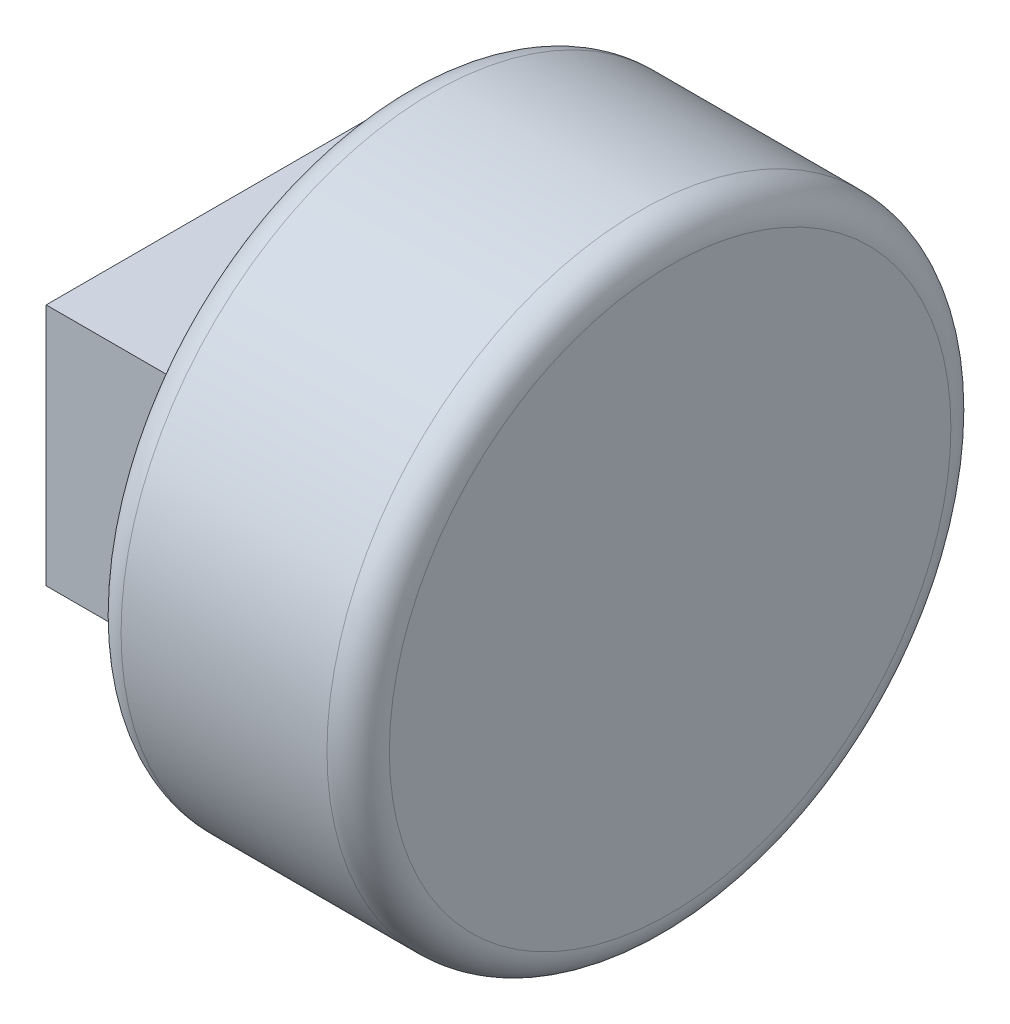
ISO-10303-21;
HEADER;
FILE_DESCRIPTION(('STEP AP214'),'2;1');
FILE_NAME('part.step','',(''),(''),'','','');
FILE_SCHEMA(('AUTOMOTIVE_DESIGN { 1 0 10303 214 1 1 1 1 }'));
ENDSEC;
DATA;
#1=APPLICATION_CONTEXT('core data for automotive mechanical design processes');
#2=APPLICATION_PROTOCOL_DEFINITION('international standard','automotive_design',2000,#1);
#3=PRODUCT_CONTEXT('',#1,'mechanical');
#4=PRODUCT('Part','Part','',(#3));
#5=PRODUCT_RELATED_PRODUCT_CATEGORY('part','',(#4));
#6=PRODUCT_DEFINITION_FORMATION('','',#4);
#7=PRODUCT_DEFINITION_CONTEXT('part definition',#1,'design');
#8=PRODUCT_DEFINITION('design','',#6,#7);
#9=PRODUCT_DEFINITION_SHAPE('','',#8);
#10=(LENGTH_UNIT() NAMED_UNIT(*) SI_UNIT(.MILLI.,.METRE.));
#11=(NAMED_UNIT(*) PLANE_ANGLE_UNIT() SI_UNIT($,.RADIAN.));
#12=(NAMED_UNIT(*) SI_UNIT($,.STERADIAN.) SOLID_ANGLE_UNIT());
#13=UNCERTAINTY_MEASURE_WITH_UNIT(LENGTH_MEASURE(1.E-05),#10,'distance_accuracy_value','');
#14=(GEOMETRIC_REPRESENTATION_CONTEXT(3) GLOBAL_UNCERTAINTY_ASSIGNED_CONTEXT((#13)) GLOBAL_UNIT_ASSIGNED_CONTEXT((#10,
#11,#12)) REPRESENTATION_CONTEXT('',''));
#15=CARTESIAN_POINT('',(0.,0.,0.));
#16=DIRECTION('',(0.,0.,1.));
#17=DIRECTION('',(1.,0.,0.));
#18=AXIS2_PLACEMENT_3D('',#15,#16,#17);
#19=CARTESIAN_POINT('',(70.,19.5,-30.));
#20=DIRECTION('',(0.,0.,1.));
#21=DIRECTION('',(1.,0.,0.));
#22=AXIS2_PLACEMENT_3D('',#19,#20,#21);
#23=PLANE('',#22);
#24=DIRECTION('',(0.,1.,0.));
#25=VECTOR('',#24,1.);
#26=CARTESIAN_POINT('',(27.,19.5,-30.));
#27=LINE('',#26,#25);
#28=CARTESIAN_POINT('',(27.,-19.5,-30.));
#29=VERTEX_POINT('',#28);
#30=CARTESIAN_POINT('',(27.,19.5,-30.));
#31=VERTEX_POINT('',#30);
#32=EDGE_CURVE('E88',#29,#31,#27,.T.);
#33=ORIENTED_EDGE('',*,*,#32,.F.);
#34=DIRECTION('',(-1.,0.,0.));
#35=VECTOR('',#34,1.);
#36=CARTESIAN_POINT('',(70.,-19.5,-30.));
#37=LINE('',#36,#35);
#38=CARTESIAN_POINT('',(0.,-19.5,-30.));
#39=VERTEX_POINT('',#38);
#40=EDGE_CURVE('E75',#29,#39,#37,.T.);
#41=ORIENTED_EDGE('',*,*,#40,.T.);
#42=DIRECTION('',(0.,1.,0.));
#43=VECTOR('',#42,1.);
#44=CARTESIAN_POINT('',(0.,19.5,-30.));
#45=LINE('',#44,#43);
#46=CARTESIAN_POINT('',(0.,19.5,-30.));
#47=VERTEX_POINT('',#46);
#48=EDGE_CURVE('E91',#39,#47,#45,.T.);
#49=ORIENTED_EDGE('',*,*,#48,.T.);
#50=DIRECTION('',(-1.,0.,0.));
#51=VECTOR('',#50,1.);
#52=CARTESIAN_POINT('',(70.,19.5,-30.));
#53=LINE('',#52,#51);
#54=EDGE_CURVE('E89',#31,#47,#53,.T.);
#55=ORIENTED_EDGE('',*,*,#54,.F.);
#56=EDGE_LOOP('',(#33,#41,#49,#55));
#57=FACE_BOUND('',#56,.T.);
#58=ADVANCED_FACE('F34',(#57),#23,.F.);
#59=CARTESIAN_POINT('',(70.,19.5,30.));
#60=DIRECTION('',(0.,-1.,0.));
#61=DIRECTION('',(0.,0.,-1.));
#62=AXIS2_PLACEMENT_3D('',#59,#60,#61);
#63=PLANE('',#62);
#64=CARTESIAN_POINT('',(13.,19.5,0.));
#65=DIRECTION('',(0.,1.,0.));
#66=DIRECTION('',(0.,0.,1.));
#67=AXIS2_PLACEMENT_3D('',#64,#65,#66);
#68=CIRCLE('',#67,1.5);
#69=CARTESIAN_POINT('',(13.,19.5,1.49999999999999));
#70=VERTEX_POINT('',#69);
#71=EDGE_CURVE('E174',#70,#70,#68,.T.);
#72=ORIENTED_EDGE('',*,*,#71,.F.);
#73=EDGE_LOOP('',(#72));
#74=FACE_BOUND('',#73,.T.);
#75=DIRECTION('',(0.,0.,1.));
#76=VECTOR('',#75,1.);
#77=CARTESIAN_POINT('',(27.,19.5,30.));
#78=LINE('',#77,#76);
#79=CARTESIAN_POINT('',(27.,19.5,30.));
#80=VERTEX_POINT('',#79);
#81=EDGE_CURVE('E49',#31,#80,#78,.T.);
#82=ORIENTED_EDGE('',*,*,#81,.F.);
#83=ORIENTED_EDGE('',*,*,#54,.T.);
#84=DIRECTION('',(0.,0.,1.));
#85=VECTOR('',#84,1.);
#86=CARTESIAN_POINT('',(0.,19.5,30.));
#87=LINE('',#86,#85);
#88=CARTESIAN_POINT('',(0.,19.5,30.));
#89=VERTEX_POINT('',#88);
#90=EDGE_CURVE('E194',#47,#89,#87,.T.);
#91=ORIENTED_EDGE('',*,*,#90,.T.);
#92=DIRECTION('',(-1.,0.,0.));
#93=VECTOR('',#92,1.);
#94=CARTESIAN_POINT('',(70.,19.5,30.));
#95=LINE('',#94,#93);
#96=EDGE_CURVE('E99',#80,#89,#95,.T.);
#97=ORIENTED_EDGE('',*,*,#96,.F.);
#98=EDGE_LOOP('',(#82,#83,#91,#97));
#99=FACE_BOUND('',#98,.T.);
#100=ADVANCED_FACE('F125',(#74,#99),#63,.F.);
#101=CARTESIAN_POINT('',(70.,19.5,30.));
#102=DIRECTION('',(0.,0.,-1.));
#103=DIRECTION('',(-1.,0.,0.));
#104=AXIS2_PLACEMENT_3D('',#101,#102,#103);
#105=PLANE('',#104);
#106=DIRECTION('',(0.,-1.,0.));
#107=VECTOR('',#106,1.);
#108=CARTESIAN_POINT('',(27.,19.5,30.));
#109=LINE('',#108,#107);
#110=CARTESIAN_POINT('',(27.,-19.5,30.));
#111=VERTEX_POINT('',#110);
#112=EDGE_CURVE('E57',#80,#111,#109,.T.);
#113=ORIENTED_EDGE('',*,*,#112,.F.);
#114=ORIENTED_EDGE('',*,*,#96,.T.);
#115=DIRECTION('',(0.,-1.,0.));
#116=VECTOR('',#115,1.);
#117=CARTESIAN_POINT('',(0.,19.5,30.));
#118=LINE('',#117,#116);
#119=CARTESIAN_POINT('',(0.,-19.5,30.));
#120=VERTEX_POINT('',#119);
#121=EDGE_CURVE('E197',#89,#120,#118,.T.);
#122=ORIENTED_EDGE('',*,*,#121,.T.);
#123=DIRECTION('',(-1.,0.,0.));
#124=VECTOR('',#123,1.);
#125=CARTESIAN_POINT('',(70.,-19.5,30.));
#126=LINE('',#125,#124);
#127=EDGE_CURVE('E85',#111,#120,#126,.T.);
#128=ORIENTED_EDGE('',*,*,#127,.F.);
#129=EDGE_LOOP('',(#113,#114,#122,#128));
#130=FACE_BOUND('',#129,.T.);
#131=ADVANCED_FACE('F130',(#130),#105,.F.);
#132=CARTESIAN_POINT('',(70.,-19.5,30.));
#133=DIRECTION('',(0.,1.,0.));
#134=DIRECTION('',(0.,0.,1.));
#135=AXIS2_PLACEMENT_3D('',#132,#133,#134);
#136=PLANE('',#135);
#137=CARTESIAN_POINT('',(8.,-19.5,13.5));
#138=DIRECTION('',(0.,-1.,0.));
#139=DIRECTION('',(0.,0.,-1.));
#140=AXIS2_PLACEMENT_3D('',#137,#138,#139);
#141=CIRCLE('',#140,1.5);
#142=CARTESIAN_POINT('',(8.,-19.5,12.));
#143=VERTEX_POINT('',#142);
#144=EDGE_CURVE('E175',#143,#143,#141,.T.);
#145=ORIENTED_EDGE('',*,*,#144,.F.);
#146=EDGE_LOOP('',(#145));
#147=FACE_BOUND('',#146,.T.);
#148=CARTESIAN_POINT('',(8.00000000000001,-19.5,-13.25));
#149=DIRECTION('',(0.,-1.,0.));
#150=DIRECTION('',(0.,0.,-1.));
#151=AXIS2_PLACEMENT_3D('',#148,#149,#150);
#152=CIRCLE('',#151,1.5);
#153=CARTESIAN_POINT('',(8.00000000000001,-19.5,-14.75));
#154=VERTEX_POINT('',#153);
#155=EDGE_CURVE('E186',#154,#154,#152,.T.);
#156=ORIENTED_EDGE('',*,*,#155,.F.);
#157=EDGE_LOOP('',(#156));
#158=FACE_BOUND('',#157,.T.);
#159=DIRECTION('',(0.,0.,-1.));
#160=VECTOR('',#159,1.);
#161=CARTESIAN_POINT('',(27.,-19.5,30.));
#162=LINE('',#161,#160);
#163=EDGE_CURVE('E79',#111,#29,#162,.T.);
#164=ORIENTED_EDGE('',*,*,#163,.F.);
#165=ORIENTED_EDGE('',*,*,#127,.T.);
#166=DIRECTION('',(0.,0.,-1.));
#167=VECTOR('',#166,1.);
#168=CARTESIAN_POINT('',(0.,-19.5,30.));
#169=LINE('',#168,#167);
#170=EDGE_CURVE('E81',#120,#39,#169,.T.);
#171=ORIENTED_EDGE('',*,*,#170,.T.);
#172=ORIENTED_EDGE('',*,*,#40,.F.);
#173=EDGE_LOOP('',(#164,#165,#171,#172));
#174=FACE_BOUND('',#173,.T.);
#175=ADVANCED_FACE('F77',(#147,#158,#174),#136,.F.);
#176=CARTESIAN_POINT('',(0.,0.,0.));
#177=DIRECTION('',(1.,0.,0.));
#178=DIRECTION('',(0.,0.,-1.));
#179=AXIS2_PLACEMENT_3D('',#176,#177,#178);
#180=PLANE('',#179);
#181=ORIENTED_EDGE('',*,*,#48,.F.);
#182=ORIENTED_EDGE('',*,*,#170,.F.);
#183=ORIENTED_EDGE('',*,*,#121,.F.);
#184=ORIENTED_EDGE('',*,*,#90,.F.);
#185=EDGE_LOOP('',(#181,#182,#183,#184));
#186=FACE_BOUND('',#185,.T.);
#187=ADVANCED_FACE('F138',(#186),#180,.F.);
#188=CARTESIAN_POINT('',(27.,0.,0.));
#189=DIRECTION('',(1.,0.,0.));
#190=DIRECTION('',(0.,0.,-1.));
#191=AXIS2_PLACEMENT_3D('',#188,#189,#190);
#192=PLANE('',#191);
#193=CARTESIAN_POINT('',(27.,0.,0.));
#194=DIRECTION('',(1.,0.,0.));
#195=DIRECTION('',(0.,0.,-1.));
#196=AXIS2_PLACEMENT_3D('',#193,#194,#195);
#197=CIRCLE('',#196,45.);
#198=CARTESIAN_POINT('',(27.,0.,-45.));
#199=VERTEX_POINT('',#198);
#200=EDGE_CURVE('E11',#199,#199,#197,.F.);
#201=ORIENTED_EDGE('',*,*,#200,.T.);
#202=EDGE_LOOP('',(#201));
#203=FACE_BOUND('',#202,.T.);
#204=ORIENTED_EDGE('',*,*,#163,.T.);
#205=ORIENTED_EDGE('',*,*,#32,.T.);
#206=ORIENTED_EDGE('',*,*,#81,.T.);
#207=ORIENTED_EDGE('',*,*,#112,.T.);
#208=EDGE_LOOP('',(#204,#205,#206,#207));
#209=FACE_BOUND('',#208,.T.);
#210=ADVANCED_FACE('F93',(#203,#209),#192,.F.);
#211=CARTESIAN_POINT('',(27.,0.,0.));
#212=DIRECTION('',(1.,0.,0.));
#213=DIRECTION('',(0.,0.,-1.));
#214=AXIS2_PLACEMENT_3D('',#211,#212,#213);
#215=CYLINDRICAL_SURFACE('',#214,50.);
#216=CARTESIAN_POINT('',(32.,0.,0.));
#217=DIRECTION('',(1.,0.,0.));
#218=DIRECTION('',(0.,0.,-1.));
#219=AXIS2_PLACEMENT_3D('',#216,#217,#218);
#220=CIRCLE('',#219,50.);
#221=CARTESIAN_POINT('',(32.,0.,-50.));
#222=VERTEX_POINT('',#221);
#223=EDGE_CURVE('E42',#222,#222,#220,.T.);
#224=ORIENTED_EDGE('',*,*,#223,.T.);
#225=EDGE_LOOP('',(#224));
#226=FACE_BOUND('',#225,.T.);
#227=CARTESIAN_POINT('',(65.,0.,0.));
#228=DIRECTION('',(1.,0.,0.));
#229=DIRECTION('',(0.,0.,-1.));
#230=AXIS2_PLACEMENT_3D('',#227,#228,#229);
#231=CIRCLE('',#230,50.);
#232=CARTESIAN_POINT('',(65.,0.,-50.));
#233=VERTEX_POINT('',#232);
#234=EDGE_CURVE('E97',#233,#233,#231,.F.);
#235=ORIENTED_EDGE('',*,*,#234,.T.);
#236=EDGE_LOOP('',(#235));
#237=FACE_BOUND('',#236,.T.);
#238=ADVANCED_FACE('F107',(#226,#237),#215,.T.);
#239=CARTESIAN_POINT('',(70.,0.,0.));
#240=DIRECTION('',(1.,0.,0.));
#241=DIRECTION('',(0.,0.,-1.));
#242=AXIS2_PLACEMENT_3D('',#239,#240,#241);
#243=PLANE('',#242);
#244=CARTESIAN_POINT('',(70.,0.,0.));
#245=DIRECTION('',(1.,0.,0.));
#246=DIRECTION('',(0.,0.,-1.));
#247=AXIS2_PLACEMENT_3D('',#244,#245,#246);
#248=CIRCLE('',#247,45.);
#249=CARTESIAN_POINT('',(70.,0.,-45.));
#250=VERTEX_POINT('',#249);
#251=EDGE_CURVE('E94',#250,#250,#248,.T.);
#252=ORIENTED_EDGE('',*,*,#251,.T.);
#253=EDGE_LOOP('',(#252));
#254=FACE_BOUND('',#253,.T.);
#255=ADVANCED_FACE('F121',(#254),#243,.T.);
#256=CARTESIAN_POINT('',(65.,0.,0.));
#257=DIRECTION('',(1.,0.,0.));
#258=DIRECTION('',(0.,0.,-1.));
#259=AXIS2_PLACEMENT_3D('',#256,#257,#258);
#260=TOROIDAL_SURFACE('',#259,45.,5.);
#261=ORIENTED_EDGE('',*,*,#234,.F.);
#262=EDGE_LOOP('',(#261));
#263=FACE_BOUND('',#262,.T.);
#264=ORIENTED_EDGE('',*,*,#251,.F.);
#265=EDGE_LOOP('',(#264));
#266=FACE_BOUND('',#265,.T.);
#267=ADVANCED_FACE('F112',(#263,#266),#260,.T.);
#268=CARTESIAN_POINT('',(32.,0.,0.));
#269=DIRECTION('',(1.,0.,0.));
#270=DIRECTION('',(0.,0.,-1.));
#271=AXIS2_PLACEMENT_3D('',#268,#269,#270);
#272=TOROIDAL_SURFACE('',#271,45.,5.);
#273=ORIENTED_EDGE('',*,*,#200,.F.);
#274=EDGE_LOOP('',(#273));
#275=FACE_BOUND('',#274,.T.);
#276=ORIENTED_EDGE('',*,*,#223,.F.);
#277=EDGE_LOOP('',(#276));
#278=FACE_BOUND('',#277,.T.);
#279=ADVANCED_FACE('F36',(#275,#278),#272,.T.);
#280=CARTESIAN_POINT('',(13.,16.,0.));
#281=DIRECTION('',(0.,1.,0.));
#282=DIRECTION('',(0.,0.,1.));
#283=AXIS2_PLACEMENT_3D('',#280,#281,#282);
#284=CYLINDRICAL_SURFACE('',#283,1.5);
#285=CARTESIAN_POINT('',(13.,16.,0.));
#286=DIRECTION('',(0.,1.,0.));
#287=DIRECTION('',(0.,0.,1.));
#288=AXIS2_PLACEMENT_3D('',#285,#286,#287);
#289=CIRCLE('',#288,1.5);
#290=CARTESIAN_POINT('',(13.,16.,1.49999999999999));
#291=VERTEX_POINT('',#290);
#292=EDGE_CURVE('E178',#291,#291,#289,.T.);
#293=ORIENTED_EDGE('',*,*,#292,.F.);
#294=EDGE_LOOP('',(#293));
#295=FACE_BOUND('',#294,.T.);
#296=ORIENTED_EDGE('',*,*,#71,.T.);
#297=EDGE_LOOP('',(#296));
#298=FACE_BOUND('',#297,.T.);
#299=ADVANCED_FACE('F111',(#295,#298),#284,.F.);
#300=CARTESIAN_POINT('',(13.,16.,0.));
#301=DIRECTION('',(0.,1.,0.));
#302=DIRECTION('',(0.,0.,1.));
#303=AXIS2_PLACEMENT_3D('',#300,#301,#302);
#304=PLANE('',#303);
#305=ORIENTED_EDGE('',*,*,#292,.T.);
#306=EDGE_LOOP('',(#305));
#307=FACE_BOUND('',#306,.T.);
#308=ADVANCED_FACE('F118',(#307),#304,.T.);
#309=CARTESIAN_POINT('',(8.00000000000001,-16.,-13.25));
#310=DIRECTION('',(0.,-1.,0.));
#311=DIRECTION('',(0.,0.,-1.));
#312=AXIS2_PLACEMENT_3D('',#309,#310,#311);
#313=CYLINDRICAL_SURFACE('',#312,1.5);
#314=CARTESIAN_POINT('',(8.00000000000001,-16.,-13.25));
#315=DIRECTION('',(0.,-1.,0.));
#316=DIRECTION('',(0.,0.,-1.));
#317=AXIS2_PLACEMENT_3D('',#314,#315,#316);
#318=CIRCLE('',#317,1.5);
#319=CARTESIAN_POINT('',(8.00000000000001,-16.,-14.75));
#320=VERTEX_POINT('',#319);
#321=EDGE_CURVE('E181',#320,#320,#318,.T.);
#322=ORIENTED_EDGE('',*,*,#321,.F.);
#323=EDGE_LOOP('',(#322));
#324=FACE_BOUND('',#323,.T.);
#325=ORIENTED_EDGE('',*,*,#155,.T.);
#326=EDGE_LOOP('',(#325));
#327=FACE_BOUND('',#326,.T.);
#328=ADVANCED_FACE('F153',(#324,#327),#313,.F.);
#329=CARTESIAN_POINT('',(8.00000000000001,-16.,-13.25));
#330=DIRECTION('',(0.,-1.,0.));
#331=DIRECTION('',(0.,0.,-1.));
#332=AXIS2_PLACEMENT_3D('',#329,#330,#331);
#333=PLANE('',#332);
#334=ORIENTED_EDGE('',*,*,#321,.T.);
#335=EDGE_LOOP('',(#334));
#336=FACE_BOUND('',#335,.T.);
#337=ADVANCED_FACE('F157',(#336),#333,.T.);
#338=CARTESIAN_POINT('',(8.,-16.,13.5));
#339=DIRECTION('',(0.,-1.,0.));
#340=DIRECTION('',(0.,0.,-1.));
#341=AXIS2_PLACEMENT_3D('',#338,#339,#340);
#342=CYLINDRICAL_SURFACE('',#341,1.5);
#343=CARTESIAN_POINT('',(8.,-16.,13.5));
#344=DIRECTION('',(0.,-1.,0.));
#345=DIRECTION('',(0.,0.,-1.));
#346=AXIS2_PLACEMENT_3D('',#343,#344,#345);
#347=CIRCLE('',#346,1.5);
#348=CARTESIAN_POINT('',(8.,-16.,12.));
#349=VERTEX_POINT('',#348);
#350=EDGE_CURVE('E173',#349,#349,#347,.T.);
#351=ORIENTED_EDGE('',*,*,#350,.F.);
#352=EDGE_LOOP('',(#351));
#353=FACE_BOUND('',#352,.T.);
#354=ORIENTED_EDGE('',*,*,#144,.T.);
#355=EDGE_LOOP('',(#354));
#356=FACE_BOUND('',#355,.T.);
#357=ADVANCED_FACE('F161',(#353,#356),#342,.F.);
#358=CARTESIAN_POINT('',(8.,-16.,13.5));
#359=DIRECTION('',(0.,-1.,0.));
#360=DIRECTION('',(0.,0.,-1.));
#361=AXIS2_PLACEMENT_3D('',#358,#359,#360);
#362=PLANE('',#361);
#363=ORIENTED_EDGE('',*,*,#350,.T.);
#364=EDGE_LOOP('',(#363));
#365=FACE_BOUND('',#364,.T.);
#366=ADVANCED_FACE('F165',(#365),#362,.T.);
#367=CLOSED_SHELL('',(#58,#100,#131,#175,#187,#210,#238,#255,#267,#279,#299,#308,#328,#337,#357,#366));
#368=MANIFOLD_SOLID_BREP('B2',#367);
#369=ADVANCED_BREP_SHAPE_REPRESENTATION('',(#18,#368),#14);
#370=SHAPE_DEFINITION_REPRESENTATION(#9,#369);
ENDSEC;
END-ISO-10303-21;
